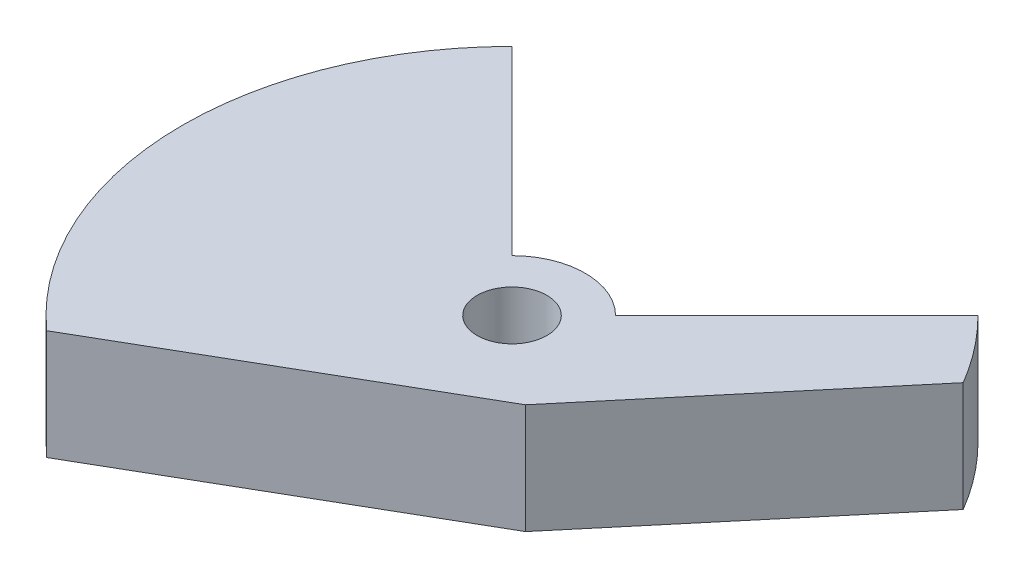
ISO-10303-21;
HEADER;
FILE_DESCRIPTION(('STEP AP214'),'2;1');
FILE_NAME('part.step','',(''),(''),'','','');
FILE_SCHEMA(('AUTOMOTIVE_DESIGN { 1 0 10303 214 1 1 1 1 }'));
ENDSEC;
DATA;
#1=APPLICATION_CONTEXT('core data for automotive mechanical design processes');
#2=APPLICATION_PROTOCOL_DEFINITION('international standard','automotive_design',2000,#1);
#3=PRODUCT_CONTEXT('',#1,'mechanical');
#4=PRODUCT('Part','Part','',(#3));
#5=PRODUCT_RELATED_PRODUCT_CATEGORY('part','',(#4));
#6=PRODUCT_DEFINITION_FORMATION('','',#4);
#7=PRODUCT_DEFINITION_CONTEXT('part definition',#1,'design');
#8=PRODUCT_DEFINITION('design','',#6,#7);
#9=PRODUCT_DEFINITION_SHAPE('','',#8);
#10=(LENGTH_UNIT() NAMED_UNIT(*) SI_UNIT(.MILLI.,.METRE.));
#11=(NAMED_UNIT(*) PLANE_ANGLE_UNIT() SI_UNIT($,.RADIAN.));
#12=(NAMED_UNIT(*) SI_UNIT($,.STERADIAN.) SOLID_ANGLE_UNIT());
#13=UNCERTAINTY_MEASURE_WITH_UNIT(LENGTH_MEASURE(1.E-05),#10,'distance_accuracy_value','');
#14=(GEOMETRIC_REPRESENTATION_CONTEXT(3) GLOBAL_UNCERTAINTY_ASSIGNED_CONTEXT((#13)) GLOBAL_UNIT_ASSIGNED_CONTEXT((#10,
#11,#12)) REPRESENTATION_CONTEXT('',''));
#15=CARTESIAN_POINT('',(0.,0.,0.));
#16=DIRECTION('',(0.,0.,1.));
#17=DIRECTION('',(1.,0.,0.));
#18=AXIS2_PLACEMENT_3D('',#15,#16,#17);
#19=CARTESIAN_POINT('',(0.,15.,0.));
#20=DIRECTION('',(0.,-1.,0.));
#21=DIRECTION('',(0.,0.,-1.));
#22=AXIS2_PLACEMENT_3D('',#19,#20,#21);
#23=CYLINDRICAL_SURFACE('',#22,45.);
#24=CARTESIAN_POINT('',(0.,0.,0.));
#25=DIRECTION('',(0.,1.,0.));
#26=DIRECTION('',(0.,0.,1.));
#27=AXIS2_PLACEMENT_3D('',#24,#25,#26);
#28=CIRCLE('',#27,45.);
#29=CARTESIAN_POINT('',(-31.8198051533945,0.,-31.8198051533948));
#30=VERTEX_POINT('',#29);
#31=CARTESIAN_POINT('',(-29.9623039946305,0.,33.5746979038285));
#32=VERTEX_POINT('',#31);
#33=EDGE_CURVE('E146',#30,#32,#28,.T.);
#34=ORIENTED_EDGE('',*,*,#33,.T.);
#35=DIRECTION('',(0.,-1.,0.));
#36=VECTOR('',#35,1.);
#37=CARTESIAN_POINT('',(-29.9623039946305,15.,33.5746979038285));
#38=LINE('',#37,#36);
#39=CARTESIAN_POINT('',(-29.9623039946305,15.,33.5746979038285));
#40=VERTEX_POINT('',#39);
#41=EDGE_CURVE('E11',#32,#40,#38,.F.);
#42=ORIENTED_EDGE('',*,*,#41,.T.);
#43=CARTESIAN_POINT('',(0.,15.,0.));
#44=DIRECTION('',(0.,1.,0.));
#45=DIRECTION('',(0.,0.,1.));
#46=AXIS2_PLACEMENT_3D('',#43,#44,#45);
#47=CIRCLE('',#46,45.);
#48=CARTESIAN_POINT('',(-31.8198051533945,15.,-31.8198051533948));
#49=VERTEX_POINT('',#48);
#50=EDGE_CURVE('E137',#49,#40,#47,.T.);
#51=ORIENTED_EDGE('',*,*,#50,.F.);
#52=DIRECTION('',(0.,-1.,0.));
#53=VECTOR('',#52,1.);
#54=CARTESIAN_POINT('',(-31.8198051533945,15.,-31.8198051533948));
#55=LINE('',#54,#53);
#56=EDGE_CURVE('E152',#49,#30,#55,.T.);
#57=ORIENTED_EDGE('',*,*,#56,.T.);
#58=EDGE_LOOP('',(#34,#42,#51,#57));
#59=FACE_BOUND('',#58,.T.);
#60=ADVANCED_FACE('F35',(#59),#23,.T.);
#61=CARTESIAN_POINT('',(0.,15.,0.));
#62=DIRECTION('',(0.,1.,0.));
#63=DIRECTION('',(0.,0.,1.));
#64=AXIS2_PLACEMENT_3D('',#61,#62,#63);
#65=PLANE('',#64);
#66=DIRECTION('',(-0.866025403784441,0.,0.499999999999995));
#67=VECTOR('',#66,1.);
#68=CARTESIAN_POINT('',(11.4906666467847,15.,9.64181414529811));
#69=LINE('',#68,#67);
#70=CARTESIAN_POINT('',(11.4906666467847,15.,9.64181414529811));
#71=VERTEX_POINT('',#70);
#72=EDGE_CURVE('E124',#71,#40,#69,.T.);
#73=ORIENTED_EDGE('',*,*,#72,.F.);
#74=DIRECTION('',(-0.64278760968654,0.,0.766044443118977));
#75=VECTOR('',#74,1.);
#76=CARTESIAN_POINT('',(11.4906666467847,15.,9.64181414529811));
#77=LINE('',#76,#75);
#78=CARTESIAN_POINT('',(38.7618353071073,15.,-22.858699079884));
#79=VERTEX_POINT('',#78);
#80=EDGE_CURVE('E106',#79,#71,#77,.T.);
#81=ORIENTED_EDGE('',*,*,#80,.F.);
#82=CARTESIAN_POINT('',(31.8198051533948,15.,-31.8198051533945));
#83=VERTEX_POINT('',#82);
#84=EDGE_CURVE('E136',#79,#83,#47,.T.);
#85=ORIENTED_EDGE('',*,*,#84,.T.);
#86=DIRECTION('',(-0.707106781186551,0.,0.707106781186544));
#87=VECTOR('',#86,1.);
#88=CARTESIAN_POINT('',(7.07106781186551,15.,-7.07106781186544));
#89=LINE('',#88,#87);
#90=CARTESIAN_POINT('',(7.07106781186551,15.,-7.07106781186544));
#91=VERTEX_POINT('',#90);
#92=EDGE_CURVE('E59',#83,#91,#89,.T.);
#93=ORIENTED_EDGE('',*,*,#92,.T.);
#94=CARTESIAN_POINT('',(0.,15.,0.));
#95=DIRECTION('',(0.,1.,0.));
#96=DIRECTION('',(0.,0.,1.));
#97=AXIS2_PLACEMENT_3D('',#94,#95,#96);
#98=CIRCLE('',#97,10.);
#99=CARTESIAN_POINT('',(-7.07106781186544,15.,-7.07106781186551));
#100=VERTEX_POINT('',#99);
#101=EDGE_CURVE('E133',#91,#100,#98,.T.);
#102=ORIENTED_EDGE('',*,*,#101,.T.);
#103=DIRECTION('',(-0.707106781186544,0.,-0.707106781186551));
#104=VECTOR('',#103,1.);
#105=CARTESIAN_POINT('',(-31.8198051533945,15.,-31.8198051533948));
#106=LINE('',#105,#104);
#107=EDGE_CURVE('E88',#100,#49,#106,.T.);
#108=ORIENTED_EDGE('',*,*,#107,.T.);
#109=ORIENTED_EDGE('',*,*,#50,.T.);
#110=EDGE_LOOP('',(#73,#81,#85,#93,#102,#108,#109));
#111=FACE_BOUND('',#110,.T.);
#112=CARTESIAN_POINT('',(0.,15.,0.));
#113=DIRECTION('',(0.,1.,0.));
#114=DIRECTION('',(0.,0.,1.));
#115=AXIS2_PLACEMENT_3D('',#112,#113,#114);
#116=CIRCLE('',#115,4.7625);
#117=CARTESIAN_POINT('',(0.,15.,4.7625));
#118=VERTEX_POINT('',#117);
#119=EDGE_CURVE('E127',#118,#118,#116,.T.);
#120=ORIENTED_EDGE('',*,*,#119,.F.);
#121=EDGE_LOOP('',(#120));
#122=FACE_BOUND('',#121,.T.);
#123=ADVANCED_FACE('F160',(#111,#122),#65,.T.);
#124=CARTESIAN_POINT('',(0.,0.,0.));
#125=DIRECTION('',(0.,1.,0.));
#126=DIRECTION('',(0.,0.,1.));
#127=AXIS2_PLACEMENT_3D('',#124,#125,#126);
#128=PLANE('',#127);
#129=DIRECTION('',(-0.64278760968654,0.,0.766044443118977));
#130=VECTOR('',#129,1.);
#131=CARTESIAN_POINT('',(11.4906666467847,0.,9.64181414529811));
#132=LINE('',#131,#130);
#133=CARTESIAN_POINT('',(38.7618353071073,0.,-22.858699079884));
#134=VERTEX_POINT('',#133);
#135=CARTESIAN_POINT('',(11.4906666467847,0.,9.64181414529811));
#136=VERTEX_POINT('',#135);
#137=EDGE_CURVE('E50',#134,#136,#132,.T.);
#138=ORIENTED_EDGE('',*,*,#137,.T.);
#139=DIRECTION('',(-0.866025403784441,0.,0.499999999999995));
#140=VECTOR('',#139,1.);
#141=CARTESIAN_POINT('',(11.4906666467847,0.,9.64181414529811));
#142=LINE('',#141,#140);
#143=EDGE_CURVE('E112',#136,#32,#142,.T.);
#144=ORIENTED_EDGE('',*,*,#143,.T.);
#145=ORIENTED_EDGE('',*,*,#33,.F.);
#146=DIRECTION('',(-0.707106781186544,0.,-0.707106781186551));
#147=VECTOR('',#146,1.);
#148=CARTESIAN_POINT('',(-31.8198051533945,0.,-31.8198051533948));
#149=LINE('',#148,#147);
#150=CARTESIAN_POINT('',(-7.07106781186544,0.,-7.07106781186551));
#151=VERTEX_POINT('',#150);
#152=EDGE_CURVE('E144',#151,#30,#149,.T.);
#153=ORIENTED_EDGE('',*,*,#152,.F.);
#154=CARTESIAN_POINT('',(0.,0.,0.));
#155=DIRECTION('',(0.,1.,0.));
#156=DIRECTION('',(0.,0.,1.));
#157=AXIS2_PLACEMENT_3D('',#154,#155,#156);
#158=CIRCLE('',#157,10.);
#159=CARTESIAN_POINT('',(7.07106781186551,0.,-7.07106781186544));
#160=VERTEX_POINT('',#159);
#161=EDGE_CURVE('E130',#160,#151,#158,.T.);
#162=ORIENTED_EDGE('',*,*,#161,.F.);
#163=DIRECTION('',(-0.707106781186551,0.,0.707106781186544));
#164=VECTOR('',#163,1.);
#165=CARTESIAN_POINT('',(7.07106781186551,0.,-7.07106781186544));
#166=LINE('',#165,#164);
#167=CARTESIAN_POINT('',(31.8198051533948,0.,-31.8198051533945));
#168=VERTEX_POINT('',#167);
#169=EDGE_CURVE('E80',#168,#160,#166,.T.);
#170=ORIENTED_EDGE('',*,*,#169,.F.);
#171=EDGE_CURVE('E121',#134,#168,#28,.T.);
#172=ORIENTED_EDGE('',*,*,#171,.F.);
#173=EDGE_LOOP('',(#138,#144,#145,#153,#162,#170,#172));
#174=FACE_BOUND('',#173,.T.);
#175=CARTESIAN_POINT('',(0.,0.,0.));
#176=DIRECTION('',(0.,1.,0.));
#177=DIRECTION('',(0.,0.,1.));
#178=AXIS2_PLACEMENT_3D('',#175,#176,#177);
#179=CIRCLE('',#178,4.7625);
#180=CARTESIAN_POINT('',(0.,0.,4.7625));
#181=VERTEX_POINT('',#180);
#182=EDGE_CURVE('E109',#181,#181,#179,.T.);
#183=ORIENTED_EDGE('',*,*,#182,.T.);
#184=EDGE_LOOP('',(#183));
#185=FACE_BOUND('',#184,.T.);
#186=ADVANCED_FACE('F119',(#174,#185),#128,.F.);
#187=CARTESIAN_POINT('',(0.,15.,0.));
#188=DIRECTION('',(0.,-1.,0.));
#189=DIRECTION('',(0.,0.,-1.));
#190=AXIS2_PLACEMENT_3D('',#187,#188,#189);
#191=CYLINDRICAL_SURFACE('',#190,10.);
#192=ORIENTED_EDGE('',*,*,#161,.T.);
#193=DIRECTION('',(0.,-1.,0.));
#194=VECTOR('',#193,1.);
#195=CARTESIAN_POINT('',(-7.07106781186544,15.,-7.07106781186551));
#196=LINE('',#195,#194);
#197=EDGE_CURVE('E155',#100,#151,#196,.T.);
#198=ORIENTED_EDGE('',*,*,#197,.F.);
#199=ORIENTED_EDGE('',*,*,#101,.F.);
#200=DIRECTION('',(0.,-1.,0.));
#201=VECTOR('',#200,1.);
#202=CARTESIAN_POINT('',(7.07106781186551,15.,-7.07106781186544));
#203=LINE('',#202,#201);
#204=EDGE_CURVE('E141',#91,#160,#203,.T.);
#205=ORIENTED_EDGE('',*,*,#204,.T.);
#206=EDGE_LOOP('',(#192,#198,#199,#205));
#207=FACE_BOUND('',#206,.T.);
#208=ADVANCED_FACE('F37',(#207),#191,.T.);
#209=CARTESIAN_POINT('',(-31.8198051533945,15.,-31.8198051533948));
#210=DIRECTION('',(-0.707106781186551,0.,0.707106781186544));
#211=DIRECTION('',(0.707106781186544,0.,0.707106781186551));
#212=AXIS2_PLACEMENT_3D('',#209,#210,#211);
#213=PLANE('',#212);
#214=ORIENTED_EDGE('',*,*,#152,.T.);
#215=ORIENTED_EDGE('',*,*,#56,.F.);
#216=ORIENTED_EDGE('',*,*,#107,.F.);
#217=ORIENTED_EDGE('',*,*,#197,.T.);
#218=EDGE_LOOP('',(#214,#215,#216,#217));
#219=FACE_BOUND('',#218,.T.);
#220=ADVANCED_FACE('F166',(#219),#213,.F.);
#221=ORIENTED_EDGE('',*,*,#84,.F.);
#222=DIRECTION('',(0.,-1.,0.));
#223=VECTOR('',#222,1.);
#224=CARTESIAN_POINT('',(38.7618353071073,15.,-22.858699079884));
#225=LINE('',#224,#223);
#226=EDGE_CURVE('E43',#79,#134,#225,.T.);
#227=ORIENTED_EDGE('',*,*,#226,.T.);
#228=ORIENTED_EDGE('',*,*,#171,.T.);
#229=DIRECTION('',(0.,-1.,0.));
#230=VECTOR('',#229,1.);
#231=CARTESIAN_POINT('',(31.8198051533948,15.,-31.8198051533945));
#232=LINE('',#231,#230);
#233=EDGE_CURVE('E150',#83,#168,#232,.T.);
#234=ORIENTED_EDGE('',*,*,#233,.F.);
#235=EDGE_LOOP('',(#221,#227,#228,#234));
#236=FACE_BOUND('',#235,.T.);
#237=ADVANCED_FACE('F158',(#236),#23,.T.);
#238=CARTESIAN_POINT('',(7.07106781186551,15.,-7.07106781186544));
#239=DIRECTION('',(0.707106781186544,0.,0.707106781186551));
#240=DIRECTION('',(0.707106781186551,0.,-0.707106781186544));
#241=AXIS2_PLACEMENT_3D('',#238,#239,#240);
#242=PLANE('',#241);
#243=ORIENTED_EDGE('',*,*,#169,.T.);
#244=ORIENTED_EDGE('',*,*,#204,.F.);
#245=ORIENTED_EDGE('',*,*,#92,.F.);
#246=ORIENTED_EDGE('',*,*,#233,.T.);
#247=EDGE_LOOP('',(#243,#244,#245,#246));
#248=FACE_BOUND('',#247,.T.);
#249=ADVANCED_FACE('F169',(#248),#242,.F.);
#250=CARTESIAN_POINT('',(0.,15.,0.));
#251=DIRECTION('',(0.,-1.,0.));
#252=DIRECTION('',(0.,0.,-1.));
#253=AXIS2_PLACEMENT_3D('',#250,#251,#252);
#254=CYLINDRICAL_SURFACE('',#253,4.7625);
#255=ORIENTED_EDGE('',*,*,#119,.T.);
#256=EDGE_LOOP('',(#255));
#257=FACE_BOUND('',#256,.T.);
#258=ORIENTED_EDGE('',*,*,#182,.F.);
#259=EDGE_LOOP('',(#258));
#260=FACE_BOUND('',#259,.T.);
#261=ADVANCED_FACE('F171',(#257,#260),#254,.F.);
#262=CARTESIAN_POINT('',(11.4906666467847,0.,9.64181414529811));
#263=DIRECTION('',(-0.499999999999995,0.,-0.866025403784441));
#264=DIRECTION('',(-0.866025403784442,0.,0.499999999999995));
#265=AXIS2_PLACEMENT_3D('',#262,#263,#264);
#266=PLANE('',#265);
#267=ORIENTED_EDGE('',*,*,#143,.F.);
#268=DIRECTION('',(0.,1.,0.));
#269=VECTOR('',#268,1.);
#270=CARTESIAN_POINT('',(11.4906666467847,0.,9.64181414529811));
#271=LINE('',#270,#269);
#272=EDGE_CURVE('E102',#136,#71,#271,.T.);
#273=ORIENTED_EDGE('',*,*,#272,.T.);
#274=ORIENTED_EDGE('',*,*,#72,.T.);
#275=ORIENTED_EDGE('',*,*,#41,.F.);
#276=EDGE_LOOP('',(#267,#273,#274,#275));
#277=FACE_BOUND('',#276,.T.);
#278=ADVANCED_FACE('F113',(#277),#266,.F.);
#279=CARTESIAN_POINT('',(11.4906666467847,0.,9.64181414529811));
#280=DIRECTION('',(-0.766044443118977,0.,-0.64278760968654));
#281=DIRECTION('',(-0.64278760968654,0.,0.766044443118977));
#282=AXIS2_PLACEMENT_3D('',#279,#280,#281);
#283=PLANE('',#282);
#284=ORIENTED_EDGE('',*,*,#80,.T.);
#285=ORIENTED_EDGE('',*,*,#272,.F.);
#286=ORIENTED_EDGE('',*,*,#137,.F.);
#287=ORIENTED_EDGE('',*,*,#226,.F.);
#288=EDGE_LOOP('',(#284,#285,#286,#287));
#289=FACE_BOUND('',#288,.T.);
#290=ADVANCED_FACE('F104',(#289),#283,.F.);
#291=CLOSED_SHELL('',(#60,#123,#186,#208,#220,#237,#249,#261,#278,#290));
#292=MANIFOLD_SOLID_BREP('B2',#291);
#293=ADVANCED_BREP_SHAPE_REPRESENTATION('',(#18,#292),#14);
#294=SHAPE_DEFINITION_REPRESENTATION(#9,#293);
ENDSEC;
END-ISO-10303-21;
